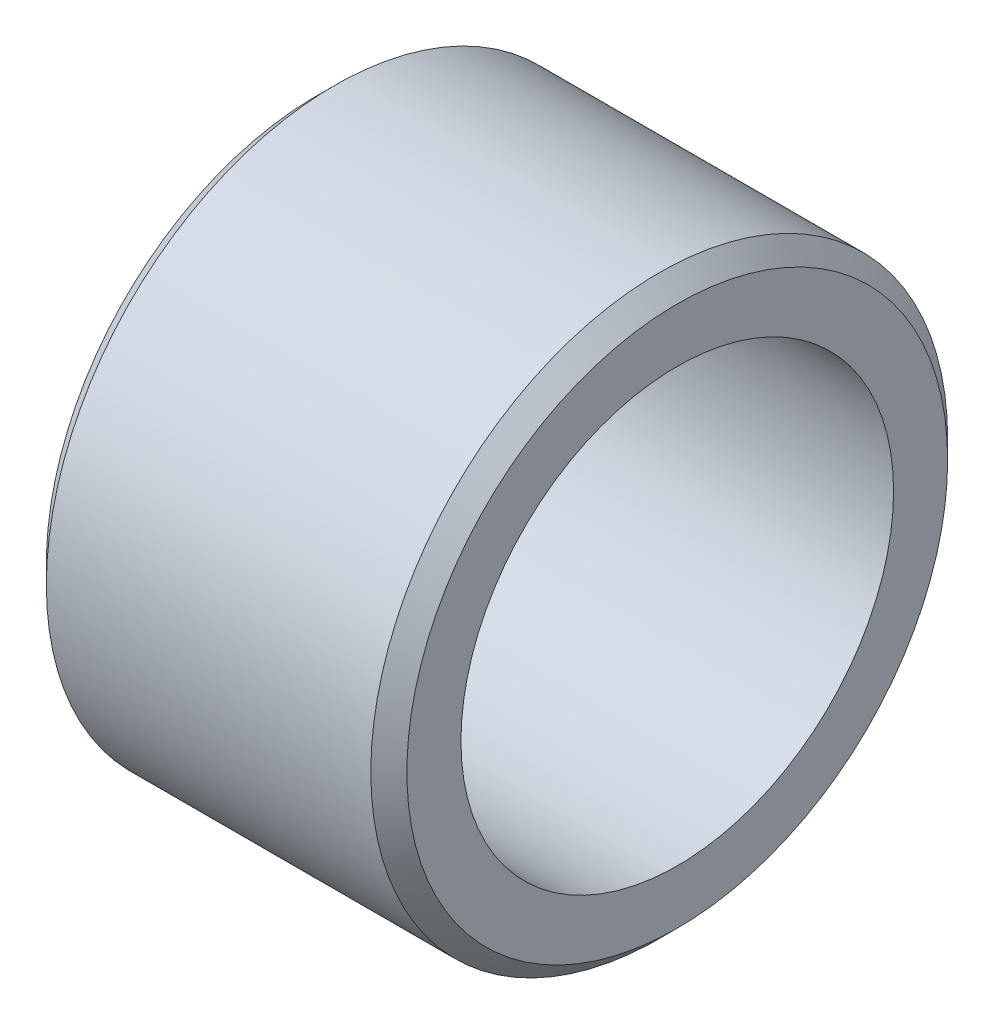
ISO-10303-21;
HEADER;
FILE_DESCRIPTION(('STEP AP214'),'2;1');
FILE_NAME('part.step','',(''),(''),'','','');
FILE_SCHEMA(('AUTOMOTIVE_DESIGN { 1 0 10303 214 1 1 1 1 }'));
ENDSEC;
DATA;
#1=APPLICATION_CONTEXT('core data for automotive mechanical design processes');
#2=APPLICATION_PROTOCOL_DEFINITION('international standard','automotive_design',2000,#1);
#3=PRODUCT_CONTEXT('',#1,'mechanical');
#4=PRODUCT('Part','Part','',(#3));
#5=PRODUCT_RELATED_PRODUCT_CATEGORY('part','',(#4));
#6=PRODUCT_DEFINITION_FORMATION('','',#4);
#7=PRODUCT_DEFINITION_CONTEXT('part definition',#1,'design');
#8=PRODUCT_DEFINITION('design','',#6,#7);
#9=PRODUCT_DEFINITION_SHAPE('','',#8);
#10=(LENGTH_UNIT() NAMED_UNIT(*) SI_UNIT(.MILLI.,.METRE.));
#11=(NAMED_UNIT(*) PLANE_ANGLE_UNIT() SI_UNIT($,.RADIAN.));
#12=(NAMED_UNIT(*) SI_UNIT($,.STERADIAN.) SOLID_ANGLE_UNIT());
#13=UNCERTAINTY_MEASURE_WITH_UNIT(LENGTH_MEASURE(1.E-05),#10,'distance_accuracy_value','');
#14=(GEOMETRIC_REPRESENTATION_CONTEXT(3) GLOBAL_UNCERTAINTY_ASSIGNED_CONTEXT((#13)) GLOBAL_UNIT_ASSIGNED_CONTEXT((#10,
#11,#12)) REPRESENTATION_CONTEXT('',''));
#15=CARTESIAN_POINT('',(0.,0.,0.));
#16=DIRECTION('',(0.,0.,1.));
#17=DIRECTION('',(1.,0.,0.));
#18=AXIS2_PLACEMENT_3D('',#15,#16,#17);
#19=CARTESIAN_POINT('',(0.,7.5,0.));
#20=DIRECTION('',(-1.,0.,0.));
#21=DIRECTION('',(0.,0.,1.));
#22=AXIS2_PLACEMENT_3D('',#19,#20,#21);
#23=PLANE('',#22);
#24=CARTESIAN_POINT('',(0.,0.,0.));
#25=DIRECTION('',(1.,0.,0.));
#26=DIRECTION('',(0.,0.,-1.));
#27=AXIS2_PLACEMENT_3D('',#24,#25,#26);
#28=CIRCLE('',#27,6.);
#29=CARTESIAN_POINT('',(0.,0.,-6.));
#30=VERTEX_POINT('',#29);
#31=EDGE_CURVE('E37',#30,#30,#28,.T.);
#32=ORIENTED_EDGE('',*,*,#31,.T.);
#33=EDGE_LOOP('',(#32));
#34=FACE_BOUND('',#33,.T.);
#35=CARTESIAN_POINT('',(0.,0.,0.));
#36=DIRECTION('',(1.,0.,0.));
#37=DIRECTION('',(0.,0.,-1.));
#38=AXIS2_PLACEMENT_3D('',#35,#36,#37);
#39=CIRCLE('',#38,7.5);
#40=CARTESIAN_POINT('',(0.,0.,-7.5));
#41=VERTEX_POINT('',#40);
#42=EDGE_CURVE('E34',#41,#41,#39,.T.);
#43=ORIENTED_EDGE('',*,*,#42,.F.);
#44=EDGE_LOOP('',(#43));
#45=FACE_BOUND('',#44,.T.);
#46=ADVANCED_FACE('F14',(#34,#45),#23,.T.);
#47=CARTESIAN_POINT('',(10.,0.,0.));
#48=DIRECTION('',(1.,0.,0.));
#49=DIRECTION('',(0.,0.,-1.));
#50=AXIS2_PLACEMENT_3D('',#47,#48,#49);
#51=CYLINDRICAL_SURFACE('',#50,6.);
#52=CARTESIAN_POINT('',(10.,0.,0.));
#53=DIRECTION('',(1.,0.,0.));
#54=DIRECTION('',(0.,0.,-1.));
#55=AXIS2_PLACEMENT_3D('',#52,#53,#54);
#56=CIRCLE('',#55,6.);
#57=CARTESIAN_POINT('',(10.,0.,-6.));
#58=VERTEX_POINT('',#57);
#59=EDGE_CURVE('E29',#58,#58,#56,.T.);
#60=ORIENTED_EDGE('',*,*,#59,.T.);
#61=EDGE_LOOP('',(#60));
#62=FACE_BOUND('',#61,.T.);
#63=ORIENTED_EDGE('',*,*,#31,.F.);
#64=EDGE_LOOP('',(#63));
#65=FACE_BOUND('',#64,.T.);
#66=ADVANCED_FACE('F43',(#62,#65),#51,.F.);
#67=CARTESIAN_POINT('',(0.5,0.,0.));
#68=DIRECTION('',(1.,0.,0.));
#69=DIRECTION('',(0.,0.,-1.));
#70=AXIS2_PLACEMENT_3D('',#67,#68,#69);
#71=CONICAL_SURFACE('',#70,8.,0.785398163397448);
#72=ORIENTED_EDGE('',*,*,#42,.T.);
#73=EDGE_LOOP('',(#72));
#74=FACE_BOUND('',#73,.T.);
#75=CARTESIAN_POINT('',(0.5,0.,0.));
#76=DIRECTION('',(1.,0.,0.));
#77=DIRECTION('',(0.,0.,-1.));
#78=AXIS2_PLACEMENT_3D('',#75,#76,#77);
#79=CIRCLE('',#78,8.);
#80=CARTESIAN_POINT('',(0.5,0.,-8.));
#81=VERTEX_POINT('',#80);
#82=EDGE_CURVE('E25',#81,#81,#79,.T.);
#83=ORIENTED_EDGE('',*,*,#82,.F.);
#84=EDGE_LOOP('',(#83));
#85=FACE_BOUND('',#84,.T.);
#86=ADVANCED_FACE('F45',(#74,#85),#71,.T.);
#87=CARTESIAN_POINT('',(10.,6.,0.));
#88=DIRECTION('',(1.,0.,0.));
#89=DIRECTION('',(0.,0.,-1.));
#90=AXIS2_PLACEMENT_3D('',#87,#88,#89);
#91=PLANE('',#90);
#92=CARTESIAN_POINT('',(10.,0.,0.));
#93=DIRECTION('',(1.,0.,0.));
#94=DIRECTION('',(0.,0.,-1.));
#95=AXIS2_PLACEMENT_3D('',#92,#93,#94);
#96=CIRCLE('',#95,7.5);
#97=CARTESIAN_POINT('',(10.,0.,-7.5));
#98=VERTEX_POINT('',#97);
#99=EDGE_CURVE('E21',#98,#98,#96,.T.);
#100=ORIENTED_EDGE('',*,*,#99,.T.);
#101=EDGE_LOOP('',(#100));
#102=FACE_BOUND('',#101,.T.);
#103=ORIENTED_EDGE('',*,*,#59,.F.);
#104=EDGE_LOOP('',(#103));
#105=FACE_BOUND('',#104,.T.);
#106=ADVANCED_FACE('F53',(#102,#105),#91,.T.);
#107=CARTESIAN_POINT('',(10.,0.,0.));
#108=DIRECTION('',(1.,0.,0.));
#109=DIRECTION('',(0.,0.,-1.));
#110=AXIS2_PLACEMENT_3D('',#107,#108,#109);
#111=CYLINDRICAL_SURFACE('',#110,8.);
#112=ORIENTED_EDGE('',*,*,#82,.T.);
#113=EDGE_LOOP('',(#112));
#114=FACE_BOUND('',#113,.T.);
#115=CARTESIAN_POINT('',(9.5,0.,0.));
#116=DIRECTION('',(1.,0.,0.));
#117=DIRECTION('',(0.,0.,-1.));
#118=AXIS2_PLACEMENT_3D('',#115,#116,#117);
#119=CIRCLE('',#118,8.);
#120=CARTESIAN_POINT('',(9.5,0.,-8.));
#121=VERTEX_POINT('',#120);
#122=EDGE_CURVE('E10',#121,#121,#119,.T.);
#123=ORIENTED_EDGE('',*,*,#122,.F.);
#124=EDGE_LOOP('',(#123));
#125=FACE_BOUND('',#124,.T.);
#126=ADVANCED_FACE('F59',(#114,#125),#111,.T.);
#127=CARTESIAN_POINT('',(10.,0.,0.));
#128=DIRECTION('',(-1.,0.,0.));
#129=DIRECTION('',(0.,0.,1.));
#130=AXIS2_PLACEMENT_3D('',#127,#128,#129);
#131=CONICAL_SURFACE('',#130,7.5,0.785398163397448);
#132=ORIENTED_EDGE('',*,*,#122,.T.);
#133=EDGE_LOOP('',(#132));
#134=FACE_BOUND('',#133,.T.);
#135=ORIENTED_EDGE('',*,*,#99,.F.);
#136=EDGE_LOOP('',(#135));
#137=FACE_BOUND('',#136,.T.);
#138=ADVANCED_FACE('F16',(#134,#137),#131,.T.);
#139=CLOSED_SHELL('',(#46,#66,#86,#106,#126,#138));
#140=MANIFOLD_SOLID_BREP('B1',#139);
#141=ADVANCED_BREP_SHAPE_REPRESENTATION('',(#18,#140),#14);
#142=SHAPE_DEFINITION_REPRESENTATION(#9,#141);
ENDSEC;
END-ISO-10303-21;
